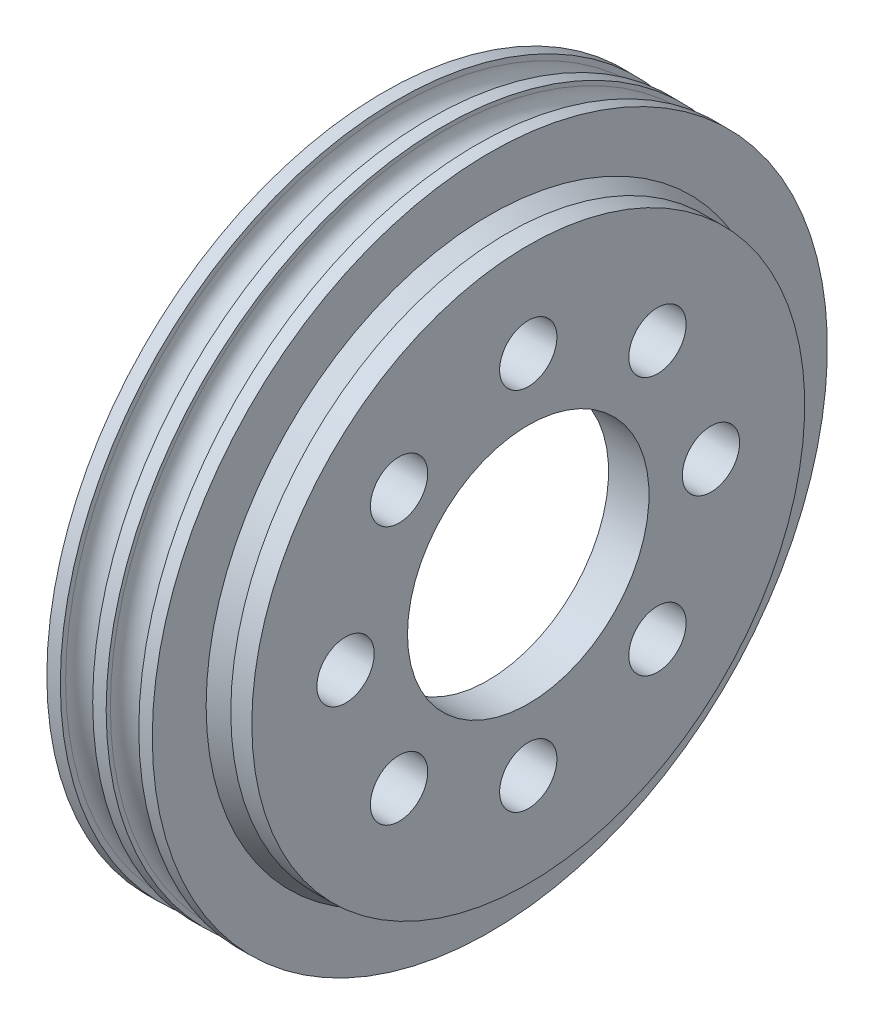
ISO-10303-21;
HEADER;
FILE_DESCRIPTION(('STEP AP214'),'2;1');
FILE_NAME('part.step','',(''),(''),'','','');
FILE_SCHEMA(('AUTOMOTIVE_DESIGN { 1 0 10303 214 1 1 1 1 }'));
ENDSEC;
DATA;
#1=APPLICATION_CONTEXT('core data for automotive mechanical design processes');
#2=APPLICATION_PROTOCOL_DEFINITION('international standard','automotive_design',2000,#1);
#3=PRODUCT_CONTEXT('',#1,'mechanical');
#4=PRODUCT('Part','Part','',(#3));
#5=PRODUCT_RELATED_PRODUCT_CATEGORY('part','',(#4));
#6=PRODUCT_DEFINITION_FORMATION('','',#4);
#7=PRODUCT_DEFINITION_CONTEXT('part definition',#1,'design');
#8=PRODUCT_DEFINITION('design','',#6,#7);
#9=PRODUCT_DEFINITION_SHAPE('','',#8);
#10=(LENGTH_UNIT() NAMED_UNIT(*) SI_UNIT(.MILLI.,.METRE.));
#11=(NAMED_UNIT(*) PLANE_ANGLE_UNIT() SI_UNIT($,.RADIAN.));
#12=(NAMED_UNIT(*) SI_UNIT($,.STERADIAN.) SOLID_ANGLE_UNIT());
#13=UNCERTAINTY_MEASURE_WITH_UNIT(LENGTH_MEASURE(1.E-05),#10,'distance_accuracy_value','');
#14=(GEOMETRIC_REPRESENTATION_CONTEXT(3) GLOBAL_UNCERTAINTY_ASSIGNED_CONTEXT((#13)) GLOBAL_UNIT_ASSIGNED_CONTEXT((#10,
#11,#12)) REPRESENTATION_CONTEXT('',''));
#15=CARTESIAN_POINT('',(0.,0.,0.));
#16=DIRECTION('',(0.,0.,1.));
#17=DIRECTION('',(1.,0.,0.));
#18=AXIS2_PLACEMENT_3D('',#15,#16,#17);
#19=CARTESIAN_POINT('',(-24.7571865671056,-45.2302228412257,0.));
#20=DIRECTION('',(-1.,0.,0.));
#21=DIRECTION('',(0.,0.,1.));
#22=AXIS2_PLACEMENT_3D('',#19,#20,#21);
#23=CYLINDRICAL_SURFACE('',#22,50.0619205916236);
#24=CARTESIAN_POINT('',(-0.743924059017714,-45.2302228412257,0.));
#25=DIRECTION('',(-1.,0.,0.));
#26=DIRECTION('',(0.,0.,1.));
#27=AXIS2_PLACEMENT_3D('',#24,#25,#26);
#28=CIRCLE('',#27,50.0619205916236);
#29=CARTESIAN_POINT('',(-0.743924059017714,-45.2302228412257,50.0619205916236));
#30=VERTEX_POINT('',#29);
#31=EDGE_CURVE('E86',#30,#30,#28,.T.);
#32=ORIENTED_EDGE('',*,*,#31,.F.);
#33=EDGE_LOOP('',(#32));
#34=FACE_BOUND('',#33,.T.);
#35=CARTESIAN_POINT('',(1.25607594098229,-45.2302228412257,0.));
#36=DIRECTION('',(-1.,0.,0.));
#37=DIRECTION('',(0.,0.,1.));
#38=AXIS2_PLACEMENT_3D('',#35,#36,#37);
#39=CIRCLE('',#38,50.0619205916236);
#40=CARTESIAN_POINT('',(1.25607594098229,-45.2302228412257,50.0619205916236));
#41=VERTEX_POINT('',#40);
#42=EDGE_CURVE('E10',#41,#41,#39,.T.);
#43=ORIENTED_EDGE('',*,*,#42,.T.);
#44=EDGE_LOOP('',(#43));
#45=FACE_BOUND('',#44,.T.);
#46=ADVANCED_FACE('F31',(#34,#45),#23,.T.);
#47=CARTESIAN_POINT('',(1.25607594098229,4.83169775039795,0.));
#48=DIRECTION('',(-1.,0.,0.));
#49=DIRECTION('',(0.,0.,1.));
#50=AXIS2_PLACEMENT_3D('',#47,#48,#49);
#51=PLANE('',#50);
#52=ORIENTED_EDGE('',*,*,#42,.F.);
#53=EDGE_LOOP('',(#52));
#54=FACE_BOUND('',#53,.T.);
#55=CARTESIAN_POINT('',(1.25607594098229,-45.2302228412257,0.));
#56=DIRECTION('',(-1.,0.,0.));
#57=DIRECTION('',(0.,0.,1.));
#58=AXIS2_PLACEMENT_3D('',#55,#56,#57);
#59=CIRCLE('',#58,42.0736581945583);
#60=CARTESIAN_POINT('',(1.25607594098229,-45.2302228412257,42.0736581945583));
#61=VERTEX_POINT('',#60);
#62=EDGE_CURVE('E37',#61,#61,#59,.T.);
#63=ORIENTED_EDGE('',*,*,#62,.T.);
#64=EDGE_LOOP('',(#63));
#65=FACE_BOUND('',#64,.T.);
#66=ADVANCED_FACE('F226',(#54,#65),#51,.F.);
#67=CARTESIAN_POINT('',(3.83593518708346,-45.2302228412257,0.));
#68=DIRECTION('',(-1.,0.,0.));
#69=DIRECTION('',(0.,0.,1.));
#70=AXIS2_PLACEMENT_3D('',#67,#68,#69);
#71=CONICAL_SURFACE('',#70,41.,0.394367245897445);
#72=ORIENTED_EDGE('',*,*,#62,.F.);
#73=EDGE_LOOP('',(#72));
#74=FACE_BOUND('',#73,.T.);
#75=CARTESIAN_POINT('',(3.83593518708346,-45.2302228412257,0.));
#76=DIRECTION('',(-1.,0.,0.));
#77=DIRECTION('',(0.,0.,1.));
#78=AXIS2_PLACEMENT_3D('',#75,#76,#77);
#79=CIRCLE('',#78,41.);
#80=CARTESIAN_POINT('',(3.83593518708346,-45.2302228412257,41.));
#81=VERTEX_POINT('',#80);
#82=EDGE_CURVE('E41',#81,#81,#79,.T.);
#83=ORIENTED_EDGE('',*,*,#82,.T.);
#84=EDGE_LOOP('',(#83));
#85=FACE_BOUND('',#84,.T.);
#86=ADVANCED_FACE('F230',(#74,#85),#71,.T.);
#87=CARTESIAN_POINT('',(-24.7571865671056,-45.2302228412257,0.));
#88=DIRECTION('',(-1.,0.,0.));
#89=DIRECTION('',(0.,0.,1.));
#90=AXIS2_PLACEMENT_3D('',#87,#88,#89);
#91=CYLINDRICAL_SURFACE('',#90,41.);
#92=ORIENTED_EDGE('',*,*,#82,.F.);
#93=EDGE_LOOP('',(#92));
#94=FACE_BOUND('',#93,.T.);
#95=CARTESIAN_POINT('',(6.95607594098228,-45.2302228412257,0.));
#96=DIRECTION('',(-1.,0.,0.));
#97=DIRECTION('',(0.,0.,1.));
#98=AXIS2_PLACEMENT_3D('',#95,#96,#97);
#99=CIRCLE('',#98,41.);
#100=CARTESIAN_POINT('',(6.95607594098228,-45.2302228412257,41.));
#101=VERTEX_POINT('',#100);
#102=EDGE_CURVE('E45',#101,#101,#99,.T.);
#103=ORIENTED_EDGE('',*,*,#102,.T.);
#104=EDGE_LOOP('',(#103));
#105=FACE_BOUND('',#104,.T.);
#106=ADVANCED_FACE('F235',(#94,#105),#91,.T.);
#107=CARTESIAN_POINT('',(6.95607594098229,-27.318302249602,0.));
#108=DIRECTION('',(-1.,0.,0.));
#109=DIRECTION('',(0.,0.,1.));
#110=AXIS2_PLACEMENT_3D('',#107,#108,#109);
#111=PLANE('',#110);
#112=CARTESIAN_POINT('',(6.95607594098229,-26.0676290710704,-19.162593770156));
#113=DIRECTION('',(-1.,0.,0.));
#114=DIRECTION('',(0.,0.,1.));
#115=AXIS2_PLACEMENT_3D('',#112,#113,#114);
#116=CIRCLE('',#115,4.25000000000054);
#117=CARTESIAN_POINT('',(6.95607594098229,-26.0676290710704,-14.9125937701555));
#118=VERTEX_POINT('',#117);
#119=EDGE_CURVE('E131',#118,#118,#116,.T.);
#120=ORIENTED_EDGE('',*,*,#119,.T.);
#121=EDGE_LOOP('',(#120));
#122=FACE_BOUND('',#121,.T.);
#123=CARTESIAN_POINT('',(6.95607594098229,-45.2302228412257,-27.0999999999996));
#124=DIRECTION('',(-1.,0.,0.));
#125=DIRECTION('',(0.,0.,1.));
#126=AXIS2_PLACEMENT_3D('',#123,#124,#125);
#127=CIRCLE('',#126,4.25);
#128=CARTESIAN_POINT('',(6.95607594098229,-45.2302228412257,-22.8499999999996));
#129=VERTEX_POINT('',#128);
#130=EDGE_CURVE('E125',#129,#129,#127,.T.);
#131=ORIENTED_EDGE('',*,*,#130,.T.);
#132=EDGE_LOOP('',(#131));
#133=FACE_BOUND('',#132,.T.);
#134=CARTESIAN_POINT('',(6.95607594098229,-64.3928166113812,-19.162593770155));
#135=DIRECTION('',(-1.,0.,0.));
#136=DIRECTION('',(0.,0.,1.));
#137=AXIS2_PLACEMENT_3D('',#134,#135,#136);
#138=CIRCLE('',#137,4.25);
#139=CARTESIAN_POINT('',(6.95607594098229,-64.3928166113812,-14.912593770155));
#140=VERTEX_POINT('',#139);
#141=EDGE_CURVE('E119',#140,#140,#138,.T.);
#142=ORIENTED_EDGE('',*,*,#141,.T.);
#143=EDGE_LOOP('',(#142));
#144=FACE_BOUND('',#143,.T.);
#145=CARTESIAN_POINT('',(6.95607594098229,-72.3302228412257,5.71033877735244E-13));
#146=DIRECTION('',(-1.,0.,0.));
#147=DIRECTION('',(0.,0.,1.));
#148=AXIS2_PLACEMENT_3D('',#145,#146,#147);
#149=CIRCLE('',#148,4.25);
#150=CARTESIAN_POINT('',(6.95607594098229,-72.3302228412257,4.25000000000057));
#151=VERTEX_POINT('',#150);
#152=EDGE_CURVE('E113',#151,#151,#149,.T.);
#153=ORIENTED_EDGE('',*,*,#152,.T.);
#154=EDGE_LOOP('',(#153));
#155=FACE_BOUND('',#154,.T.);
#156=CARTESIAN_POINT('',(6.95607594098229,-64.3928166113809,19.162593770156));
#157=DIRECTION('',(-1.,0.,0.));
#158=DIRECTION('',(0.,0.,1.));
#159=AXIS2_PLACEMENT_3D('',#156,#157,#158);
#160=CIRCLE('',#159,4.25);
#161=CARTESIAN_POINT('',(6.95607594098229,-64.3928166113809,23.412593770156));
#162=VERTEX_POINT('',#161);
#163=EDGE_CURVE('E107',#162,#162,#160,.T.);
#164=ORIENTED_EDGE('',*,*,#163,.T.);
#165=EDGE_LOOP('',(#164));
#166=FACE_BOUND('',#165,.T.);
#167=CARTESIAN_POINT('',(6.95607594098229,-45.2302228412254,27.1000000000004));
#168=DIRECTION('',(-1.,0.,0.));
#169=DIRECTION('',(0.,0.,1.));
#170=AXIS2_PLACEMENT_3D('',#167,#168,#169);
#171=CIRCLE('',#170,4.25);
#172=CARTESIAN_POINT('',(6.95607594098229,-45.2302228412254,31.3500000000004));
#173=VERTEX_POINT('',#172);
#174=EDGE_CURVE('E101',#173,#173,#171,.T.);
#175=ORIENTED_EDGE('',*,*,#174,.T.);
#176=EDGE_LOOP('',(#175));
#177=FACE_BOUND('',#176,.T.);
#178=CARTESIAN_POINT('',(6.95607594098229,-26.06762907107,19.1625937701556));
#179=DIRECTION('',(-1.,0.,0.));
#180=DIRECTION('',(0.,0.,1.));
#181=AXIS2_PLACEMENT_3D('',#178,#179,#180);
#182=CIRCLE('',#181,4.25);
#183=CARTESIAN_POINT('',(6.95607594098229,-26.06762907107,23.4125937701556));
#184=VERTEX_POINT('',#183);
#185=EDGE_CURVE('E95',#184,#184,#182,.T.);
#186=ORIENTED_EDGE('',*,*,#185,.T.);
#187=EDGE_LOOP('',(#186));
#188=FACE_BOUND('',#187,.T.);
#189=CARTESIAN_POINT('',(6.95607594098229,-18.1302228412257,0.));
#190=DIRECTION('',(-1.,0.,0.));
#191=DIRECTION('',(0.,0.,1.));
#192=AXIS2_PLACEMENT_3D('',#189,#190,#191);
#193=CIRCLE('',#192,4.25);
#194=CARTESIAN_POINT('',(6.95607594098229,-18.1302228412257,4.25));
#195=VERTEX_POINT('',#194);
#196=EDGE_CURVE('E89',#195,#195,#193,.T.);
#197=ORIENTED_EDGE('',*,*,#196,.T.);
#198=EDGE_LOOP('',(#197));
#199=FACE_BOUND('',#198,.T.);
#200=ORIENTED_EDGE('',*,*,#102,.F.);
#201=EDGE_LOOP('',(#200));
#202=FACE_BOUND('',#201,.T.);
#203=CARTESIAN_POINT('',(6.95607594098228,-45.2302228412257,0.));
#204=DIRECTION('',(-1.,0.,0.));
#205=DIRECTION('',(0.,0.,1.));
#206=AXIS2_PLACEMENT_3D('',#203,#204,#205);
#207=CIRCLE('',#206,17.9119205916236);
#208=CARTESIAN_POINT('',(6.95607594098228,-45.2302228412257,17.9119205916236));
#209=VERTEX_POINT('',#208);
#210=EDGE_CURVE('E50',#209,#209,#207,.T.);
#211=ORIENTED_EDGE('',*,*,#210,.T.);
#212=EDGE_LOOP('',(#211));
#213=FACE_BOUND('',#212,.T.);
#214=ADVANCED_FACE('F241',(#122,#133,#144,#155,#166,#177,#188,#199,#202,#213),#111,.F.);
#215=CARTESIAN_POINT('',(-24.7571865671056,-45.2302228412257,0.));
#216=DIRECTION('',(-1.,0.,0.));
#217=DIRECTION('',(0.,0.,1.));
#218=AXIS2_PLACEMENT_3D('',#215,#216,#217);
#219=CYLINDRICAL_SURFACE('',#218,17.9119205916236);
#220=ORIENTED_EDGE('',*,*,#210,.F.);
#221=EDGE_LOOP('',(#220));
#222=FACE_BOUND('',#221,.T.);
#223=CARTESIAN_POINT('',(0.956075940982286,-45.2302228412257,0.));
#224=DIRECTION('',(-1.,0.,0.));
#225=DIRECTION('',(0.,0.,1.));
#226=AXIS2_PLACEMENT_3D('',#223,#224,#225);
#227=CIRCLE('',#226,17.9119205916236);
#228=CARTESIAN_POINT('',(0.956075940982286,-45.2302228412257,17.9119205916236));
#229=VERTEX_POINT('',#228);
#230=EDGE_CURVE('E53',#229,#229,#227,.T.);
#231=ORIENTED_EDGE('',*,*,#230,.T.);
#232=EDGE_LOOP('',(#231));
#233=FACE_BOUND('',#232,.T.);
#234=ADVANCED_FACE('F145',(#222,#233),#219,.F.);
#235=CARTESIAN_POINT('',(0.956075940982286,-27.318302249602,0.));
#236=DIRECTION('',(1.,0.,0.));
#237=DIRECTION('',(0.,0.,-1.));
#238=AXIS2_PLACEMENT_3D('',#235,#236,#237);
#239=PLANE('',#238);
#240=CARTESIAN_POINT('',(0.956075940982286,-26.0676290710704,-19.162593770156));
#241=DIRECTION('',(-1.,0.,0.));
#242=DIRECTION('',(0.,0.,1.));
#243=AXIS2_PLACEMENT_3D('',#240,#241,#242);
#244=CIRCLE('',#243,4.25000000000054);
#245=CARTESIAN_POINT('',(0.956075940982286,-26.0676290710704,-14.9125937701555));
#246=VERTEX_POINT('',#245);
#247=EDGE_CURVE('E134',#246,#246,#244,.T.);
#248=ORIENTED_EDGE('',*,*,#247,.F.);
#249=EDGE_LOOP('',(#248));
#250=FACE_BOUND('',#249,.T.);
#251=CARTESIAN_POINT('',(0.956075940982286,-45.2302228412257,-27.0999999999996));
#252=DIRECTION('',(-1.,0.,0.));
#253=DIRECTION('',(0.,0.,1.));
#254=AXIS2_PLACEMENT_3D('',#251,#252,#253);
#255=CIRCLE('',#254,4.25);
#256=CARTESIAN_POINT('',(0.956075940982286,-45.2302228412257,-22.8499999999996));
#257=VERTEX_POINT('',#256);
#258=EDGE_CURVE('E128',#257,#257,#255,.T.);
#259=ORIENTED_EDGE('',*,*,#258,.F.);
#260=EDGE_LOOP('',(#259));
#261=FACE_BOUND('',#260,.T.);
#262=CARTESIAN_POINT('',(0.956075940982286,-64.3928166113812,-19.162593770155));
#263=DIRECTION('',(-1.,0.,0.));
#264=DIRECTION('',(0.,0.,1.));
#265=AXIS2_PLACEMENT_3D('',#262,#263,#264);
#266=CIRCLE('',#265,4.25);
#267=CARTESIAN_POINT('',(0.956075940982286,-64.3928166113812,-14.912593770155));
#268=VERTEX_POINT('',#267);
#269=EDGE_CURVE('E122',#268,#268,#266,.T.);
#270=ORIENTED_EDGE('',*,*,#269,.F.);
#271=EDGE_LOOP('',(#270));
#272=FACE_BOUND('',#271,.T.);
#273=CARTESIAN_POINT('',(0.956075940982286,-72.3302228412257,5.71033877735244E-13));
#274=DIRECTION('',(-1.,0.,0.));
#275=DIRECTION('',(0.,0.,1.));
#276=AXIS2_PLACEMENT_3D('',#273,#274,#275);
#277=CIRCLE('',#276,4.25);
#278=CARTESIAN_POINT('',(0.956075940982286,-72.3302228412257,4.25000000000057));
#279=VERTEX_POINT('',#278);
#280=EDGE_CURVE('E116',#279,#279,#277,.T.);
#281=ORIENTED_EDGE('',*,*,#280,.F.);
#282=EDGE_LOOP('',(#281));
#283=FACE_BOUND('',#282,.T.);
#284=CARTESIAN_POINT('',(0.956075940982286,-64.3928166113809,19.162593770156));
#285=DIRECTION('',(-1.,0.,0.));
#286=DIRECTION('',(0.,0.,1.));
#287=AXIS2_PLACEMENT_3D('',#284,#285,#286);
#288=CIRCLE('',#287,4.25);
#289=CARTESIAN_POINT('',(0.956075940982286,-64.3928166113809,23.412593770156));
#290=VERTEX_POINT('',#289);
#291=EDGE_CURVE('E110',#290,#290,#288,.T.);
#292=ORIENTED_EDGE('',*,*,#291,.F.);
#293=EDGE_LOOP('',(#292));
#294=FACE_BOUND('',#293,.T.);
#295=CARTESIAN_POINT('',(0.956075940982286,-45.2302228412254,27.1000000000004));
#296=DIRECTION('',(-1.,0.,0.));
#297=DIRECTION('',(0.,0.,1.));
#298=AXIS2_PLACEMENT_3D('',#295,#296,#297);
#299=CIRCLE('',#298,4.25);
#300=CARTESIAN_POINT('',(0.956075940982286,-45.2302228412254,31.3500000000004));
#301=VERTEX_POINT('',#300);
#302=EDGE_CURVE('E104',#301,#301,#299,.T.);
#303=ORIENTED_EDGE('',*,*,#302,.F.);
#304=EDGE_LOOP('',(#303));
#305=FACE_BOUND('',#304,.T.);
#306=CARTESIAN_POINT('',(0.956075940982286,-26.06762907107,19.1625937701556));
#307=DIRECTION('',(-1.,0.,0.));
#308=DIRECTION('',(0.,0.,1.));
#309=AXIS2_PLACEMENT_3D('',#306,#307,#308);
#310=CIRCLE('',#309,4.25);
#311=CARTESIAN_POINT('',(0.956075940982286,-26.06762907107,23.4125937701556));
#312=VERTEX_POINT('',#311);
#313=EDGE_CURVE('E98',#312,#312,#310,.T.);
#314=ORIENTED_EDGE('',*,*,#313,.F.);
#315=EDGE_LOOP('',(#314));
#316=FACE_BOUND('',#315,.T.);
#317=CARTESIAN_POINT('',(0.956075940982286,-18.1302228412257,0.));
#318=DIRECTION('',(-1.,0.,0.));
#319=DIRECTION('',(0.,0.,1.));
#320=AXIS2_PLACEMENT_3D('',#317,#318,#319);
#321=CIRCLE('',#320,4.25);
#322=CARTESIAN_POINT('',(0.956075940982286,-18.1302228412257,4.25));
#323=VERTEX_POINT('',#322);
#324=EDGE_CURVE('E92',#323,#323,#321,.T.);
#325=ORIENTED_EDGE('',*,*,#324,.F.);
#326=EDGE_LOOP('',(#325));
#327=FACE_BOUND('',#326,.T.);
#328=ORIENTED_EDGE('',*,*,#230,.F.);
#329=EDGE_LOOP('',(#328));
#330=FACE_BOUND('',#329,.T.);
#331=CARTESIAN_POINT('',(0.956075940982286,-45.2302228412257,0.));
#332=DIRECTION('',(-1.,0.,0.));
#333=DIRECTION('',(0.,0.,1.));
#334=AXIS2_PLACEMENT_3D('',#331,#332,#333);
#335=CIRCLE('',#334,36.);
#336=CARTESIAN_POINT('',(0.956075940982286,-45.2302228412257,36.));
#337=VERTEX_POINT('',#336);
#338=EDGE_CURVE('E56',#337,#337,#335,.T.);
#339=ORIENTED_EDGE('',*,*,#338,.T.);
#340=EDGE_LOOP('',(#339));
#341=FACE_BOUND('',#340,.T.);
#342=ADVANCED_FACE('F141',(#250,#261,#272,#283,#294,#305,#316,#327,#330,#341),#239,.F.);
#343=CARTESIAN_POINT('',(-14.4439240590177,-45.2302228412257,0.));
#344=DIRECTION('',(-1.,0.,0.));
#345=DIRECTION('',(0.,0.,1.));
#346=AXIS2_PLACEMENT_3D('',#343,#344,#345);
#347=CONICAL_SURFACE('',#346,43.9017869483155,0.474075015623964);
#348=ORIENTED_EDGE('',*,*,#338,.F.);
#349=EDGE_LOOP('',(#348));
#350=FACE_BOUND('',#349,.T.);
#351=CARTESIAN_POINT('',(-14.4439240590177,-45.2302228412257,0.));
#352=DIRECTION('',(-1.,0.,0.));
#353=DIRECTION('',(0.,0.,1.));
#354=AXIS2_PLACEMENT_3D('',#351,#352,#353);
#355=CIRCLE('',#354,43.9017869483155);
#356=CARTESIAN_POINT('',(-14.4439240590177,-45.2302228412257,43.9017869483155));
#357=VERTEX_POINT('',#356);
#358=EDGE_CURVE('E59',#357,#357,#355,.T.);
#359=ORIENTED_EDGE('',*,*,#358,.T.);
#360=EDGE_LOOP('',(#359));
#361=FACE_BOUND('',#360,.T.);
#362=ADVANCED_FACE('F144',(#350,#361),#347,.F.);
#363=CARTESIAN_POINT('',(-14.4439240590177,4.76977715877434,0.));
#364=DIRECTION('',(1.,0.,0.));
#365=DIRECTION('',(0.,0.,-1.));
#366=AXIS2_PLACEMENT_3D('',#363,#364,#365);
#367=PLANE('',#366);
#368=ORIENTED_EDGE('',*,*,#358,.F.);
#369=EDGE_LOOP('',(#368));
#370=FACE_BOUND('',#369,.T.);
#371=CARTESIAN_POINT('',(-14.4439240590177,-45.2302228412257,0.));
#372=DIRECTION('',(-1.,0.,0.));
#373=DIRECTION('',(0.,0.,1.));
#374=AXIS2_PLACEMENT_3D('',#371,#372,#373);
#375=CIRCLE('',#374,50.);
#376=CARTESIAN_POINT('',(-14.4439240590177,-45.2302228412257,50.));
#377=VERTEX_POINT('',#376);
#378=EDGE_CURVE('E62',#377,#377,#375,.T.);
#379=ORIENTED_EDGE('',*,*,#378,.T.);
#380=EDGE_LOOP('',(#379));
#381=FACE_BOUND('',#380,.T.);
#382=ADVANCED_FACE('F167',(#370,#381),#367,.F.);
#383=CARTESIAN_POINT('',(-24.7571865671056,-45.2302228412257,0.));
#384=DIRECTION('',(-1.,0.,0.));
#385=DIRECTION('',(0.,0.,1.));
#386=AXIS2_PLACEMENT_3D('',#383,#384,#385);
#387=CYLINDRICAL_SURFACE('',#386,50.);
#388=ORIENTED_EDGE('',*,*,#378,.F.);
#389=EDGE_LOOP('',(#388));
#390=FACE_BOUND('',#389,.T.);
#391=CARTESIAN_POINT('',(-12.4439240590177,-45.2302228412257,0.));
#392=DIRECTION('',(-1.,0.,0.));
#393=DIRECTION('',(0.,0.,1.));
#394=AXIS2_PLACEMENT_3D('',#391,#392,#393);
#395=CIRCLE('',#394,50.);
#396=CARTESIAN_POINT('',(-12.4439240590177,-45.2302228412257,50.));
#397=VERTEX_POINT('',#396);
#398=EDGE_CURVE('E65',#397,#397,#395,.T.);
#399=ORIENTED_EDGE('',*,*,#398,.T.);
#400=EDGE_LOOP('',(#399));
#401=FACE_BOUND('',#400,.T.);
#402=ADVANCED_FACE('F173',(#390,#401),#387,.T.);
#403=CARTESIAN_POINT('',(-12.4439240590177,4.76977715877434,0.));
#404=DIRECTION('',(-1.,0.,0.));
#405=DIRECTION('',(0.,0.,1.));
#406=AXIS2_PLACEMENT_3D('',#403,#404,#405);
#407=PLANE('',#406);
#408=ORIENTED_EDGE('',*,*,#398,.F.);
#409=EDGE_LOOP('',(#408));
#410=FACE_BOUND('',#409,.T.);
#411=CARTESIAN_POINT('',(-12.4439240590177,-45.2302228412257,0.));
#412=DIRECTION('',(-1.,0.,0.));
#413=DIRECTION('',(0.,0.,1.));
#414=AXIS2_PLACEMENT_3D('',#411,#412,#413);
#415=CIRCLE('',#414,49.2139760602775);
#416=CARTESIAN_POINT('',(-12.4439240590177,-45.2302228412257,49.2139760602775));
#417=VERTEX_POINT('',#416);
#418=EDGE_CURVE('E68',#417,#417,#415,.T.);
#419=ORIENTED_EDGE('',*,*,#418,.T.);
#420=EDGE_LOOP('',(#419));
#421=FACE_BOUND('',#420,.T.);
#422=ADVANCED_FACE('F179',(#410,#421),#407,.F.);
#423=CARTESIAN_POINT('',(-10.0439240590177,-45.2302228412257,0.));
#424=DIRECTION('',(-1.,0.,0.));
#425=DIRECTION('',(0.,0.,1.));
#426=AXIS2_PLACEMENT_3D('',#423,#424,#425);
#427=TOROIDAL_SURFACE('',#426,49.2139760602775,2.4);
#428=ORIENTED_EDGE('',*,*,#418,.F.);
#429=EDGE_LOOP('',(#428));
#430=FACE_BOUND('',#429,.T.);
#431=CARTESIAN_POINT('',(-7.64392405901772,-45.2302228412257,0.));
#432=DIRECTION('',(-1.,0.,0.));
#433=DIRECTION('',(0.,0.,1.));
#434=AXIS2_PLACEMENT_3D('',#431,#432,#433);
#435=CIRCLE('',#434,49.2139760602775);
#436=CARTESIAN_POINT('',(-7.64392405901772,-45.2302228412257,49.2139760602775));
#437=VERTEX_POINT('',#436);
#438=EDGE_CURVE('E71',#437,#437,#435,.T.);
#439=ORIENTED_EDGE('',*,*,#438,.T.);
#440=EDGE_LOOP('',(#439));
#441=FACE_BOUND('',#440,.T.);
#442=ADVANCED_FACE('F185',(#430,#441),#427,.F.);
#443=CARTESIAN_POINT('',(-7.64392405901772,3.98375321905186,0.));
#444=DIRECTION('',(1.,0.,0.));
#445=DIRECTION('',(0.,0.,-1.));
#446=AXIS2_PLACEMENT_3D('',#443,#444,#445);
#447=PLANE('',#446);
#448=ORIENTED_EDGE('',*,*,#438,.F.);
#449=EDGE_LOOP('',(#448));
#450=FACE_BOUND('',#449,.T.);
#451=CARTESIAN_POINT('',(-7.64392405901772,-45.2302228412257,0.));
#452=DIRECTION('',(-1.,0.,0.));
#453=DIRECTION('',(0.,0.,1.));
#454=AXIS2_PLACEMENT_3D('',#451,#452,#453);
#455=CIRCLE('',#454,50.);
#456=CARTESIAN_POINT('',(-7.64392405901772,-45.2302228412257,50.));
#457=VERTEX_POINT('',#456);
#458=EDGE_CURVE('E74',#457,#457,#455,.T.);
#459=ORIENTED_EDGE('',*,*,#458,.T.);
#460=EDGE_LOOP('',(#459));
#461=FACE_BOUND('',#460,.T.);
#462=ADVANCED_FACE('F191',(#450,#461),#447,.F.);
#463=CARTESIAN_POINT('',(-24.7571865671056,-45.2302228412257,0.));
#464=DIRECTION('',(-1.,0.,0.));
#465=DIRECTION('',(0.,0.,1.));
#466=AXIS2_PLACEMENT_3D('',#463,#464,#465);
#467=CYLINDRICAL_SURFACE('',#466,50.);
#468=ORIENTED_EDGE('',*,*,#458,.F.);
#469=EDGE_LOOP('',(#468));
#470=FACE_BOUND('',#469,.T.);
#471=CARTESIAN_POINT('',(-5.64392405901772,-45.2302228412257,0.));
#472=DIRECTION('',(-1.,0.,0.));
#473=DIRECTION('',(0.,0.,1.));
#474=AXIS2_PLACEMENT_3D('',#471,#472,#473);
#475=CIRCLE('',#474,50.);
#476=CARTESIAN_POINT('',(-5.64392405901772,-45.2302228412257,50.));
#477=VERTEX_POINT('',#476);
#478=EDGE_CURVE('E77',#477,#477,#475,.T.);
#479=ORIENTED_EDGE('',*,*,#478,.T.);
#480=EDGE_LOOP('',(#479));
#481=FACE_BOUND('',#480,.T.);
#482=ADVANCED_FACE('F197',(#470,#481),#467,.T.);
#483=CARTESIAN_POINT('',(-5.64392405901772,4.15038965049702,0.));
#484=DIRECTION('',(-1.,0.,0.));
#485=DIRECTION('',(0.,0.,1.));
#486=AXIS2_PLACEMENT_3D('',#483,#484,#485);
#487=PLANE('',#486);
#488=ORIENTED_EDGE('',*,*,#478,.F.);
#489=EDGE_LOOP('',(#488));
#490=FACE_BOUND('',#489,.T.);
#491=CARTESIAN_POINT('',(-5.64392405901772,-45.2302228412257,0.));
#492=DIRECTION('',(-1.,0.,0.));
#493=DIRECTION('',(0.,0.,1.));
#494=AXIS2_PLACEMENT_3D('',#491,#492,#493);
#495=CIRCLE('',#494,49.3806124917227);
#496=CARTESIAN_POINT('',(-5.64392405901772,-45.2302228412257,49.3806124917227));
#497=VERTEX_POINT('',#496);
#498=EDGE_CURVE('E80',#497,#497,#495,.T.);
#499=ORIENTED_EDGE('',*,*,#498,.T.);
#500=EDGE_LOOP('',(#499));
#501=FACE_BOUND('',#500,.T.);
#502=ADVANCED_FACE('F203',(#490,#501),#487,.F.);
#503=CARTESIAN_POINT('',(-3.19392405901771,-45.2302228412257,0.));
#504=DIRECTION('',(-1.,0.,0.));
#505=DIRECTION('',(0.,0.,1.));
#506=AXIS2_PLACEMENT_3D('',#503,#504,#505);
#507=TOROIDAL_SURFACE('',#506,49.3806124917227,2.45);
#508=ORIENTED_EDGE('',*,*,#498,.F.);
#509=EDGE_LOOP('',(#508));
#510=FACE_BOUND('',#509,.T.);
#511=CARTESIAN_POINT('',(-0.743924059017714,-45.2302228412257,0.));
#512=DIRECTION('',(-1.,0.,0.));
#513=DIRECTION('',(0.,0.,1.));
#514=AXIS2_PLACEMENT_3D('',#511,#512,#513);
#515=CIRCLE('',#514,49.3806124917227);
#516=CARTESIAN_POINT('',(-0.743924059017714,-45.2302228412257,49.3806124917227));
#517=VERTEX_POINT('',#516);
#518=EDGE_CURVE('E83',#517,#517,#515,.T.);
#519=ORIENTED_EDGE('',*,*,#518,.T.);
#520=EDGE_LOOP('',(#519));
#521=FACE_BOUND('',#520,.T.);
#522=ADVANCED_FACE('F209',(#510,#521),#507,.F.);
#523=CARTESIAN_POINT('',(-0.743924059017714,4.83169775039795,0.));
#524=DIRECTION('',(1.,0.,0.));
#525=DIRECTION('',(0.,0.,-1.));
#526=AXIS2_PLACEMENT_3D('',#523,#524,#525);
#527=PLANE('',#526);
#528=ORIENTED_EDGE('',*,*,#518,.F.);
#529=EDGE_LOOP('',(#528));
#530=FACE_BOUND('',#529,.T.);
#531=ORIENTED_EDGE('',*,*,#31,.T.);
#532=EDGE_LOOP('',(#531));
#533=FACE_BOUND('',#532,.T.);
#534=ADVANCED_FACE('F215',(#530,#533),#527,.F.);
#535=CARTESIAN_POINT('',(10.9560759409823,-18.1302228412257,0.));
#536=DIRECTION('',(-1.,0.,0.));
#537=DIRECTION('',(0.,0.,1.));
#538=AXIS2_PLACEMENT_3D('',#535,#536,#537);
#539=CYLINDRICAL_SURFACE('',#538,4.25);
#540=ORIENTED_EDGE('',*,*,#324,.T.);
#541=EDGE_LOOP('',(#540));
#542=FACE_BOUND('',#541,.T.);
#543=ORIENTED_EDGE('',*,*,#196,.F.);
#544=EDGE_LOOP('',(#543));
#545=FACE_BOUND('',#544,.T.);
#546=ADVANCED_FACE('F221',(#542,#545),#539,.F.);
#547=CARTESIAN_POINT('',(10.9560759409823,-26.06762907107,19.1625937701556));
#548=DIRECTION('',(-1.,0.,0.));
#549=DIRECTION('',(0.,0.,1.));
#550=AXIS2_PLACEMENT_3D('',#547,#548,#549);
#551=CYLINDRICAL_SURFACE('',#550,4.25);
#552=ORIENTED_EDGE('',*,*,#313,.T.);
#553=EDGE_LOOP('',(#552));
#554=FACE_BOUND('',#553,.T.);
#555=ORIENTED_EDGE('',*,*,#185,.F.);
#556=EDGE_LOOP('',(#555));
#557=FACE_BOUND('',#556,.T.);
#558=ADVANCED_FACE('F251',(#554,#557),#551,.F.);
#559=CARTESIAN_POINT('',(10.9560759409823,-45.2302228412254,27.1000000000004));
#560=DIRECTION('',(-1.,0.,0.));
#561=DIRECTION('',(0.,0.,1.));
#562=AXIS2_PLACEMENT_3D('',#559,#560,#561);
#563=CYLINDRICAL_SURFACE('',#562,4.25);
#564=ORIENTED_EDGE('',*,*,#302,.T.);
#565=EDGE_LOOP('',(#564));
#566=FACE_BOUND('',#565,.T.);
#567=ORIENTED_EDGE('',*,*,#174,.F.);
#568=EDGE_LOOP('',(#567));
#569=FACE_BOUND('',#568,.T.);
#570=ADVANCED_FACE('F255',(#566,#569),#563,.F.);
#571=CARTESIAN_POINT('',(10.9560759409823,-64.3928166113809,19.162593770156));
#572=DIRECTION('',(-1.,0.,0.));
#573=DIRECTION('',(0.,0.,1.));
#574=AXIS2_PLACEMENT_3D('',#571,#572,#573);
#575=CYLINDRICAL_SURFACE('',#574,4.25);
#576=ORIENTED_EDGE('',*,*,#291,.T.);
#577=EDGE_LOOP('',(#576));
#578=FACE_BOUND('',#577,.T.);
#579=ORIENTED_EDGE('',*,*,#163,.F.);
#580=EDGE_LOOP('',(#579));
#581=FACE_BOUND('',#580,.T.);
#582=ADVANCED_FACE('F259',(#578,#581),#575,.F.);
#583=CARTESIAN_POINT('',(10.9560759409823,-72.3302228412257,5.71033877735244E-13));
#584=DIRECTION('',(-1.,0.,0.));
#585=DIRECTION('',(0.,0.,1.));
#586=AXIS2_PLACEMENT_3D('',#583,#584,#585);
#587=CYLINDRICAL_SURFACE('',#586,4.25);
#588=ORIENTED_EDGE('',*,*,#280,.T.);
#589=EDGE_LOOP('',(#588));
#590=FACE_BOUND('',#589,.T.);
#591=ORIENTED_EDGE('',*,*,#152,.F.);
#592=EDGE_LOOP('',(#591));
#593=FACE_BOUND('',#592,.T.);
#594=ADVANCED_FACE('F263',(#590,#593),#587,.F.);
#595=CARTESIAN_POINT('',(10.9560759409823,-64.3928166113812,-19.162593770155));
#596=DIRECTION('',(-1.,0.,0.));
#597=DIRECTION('',(0.,0.,1.));
#598=AXIS2_PLACEMENT_3D('',#595,#596,#597);
#599=CYLINDRICAL_SURFACE('',#598,4.25);
#600=ORIENTED_EDGE('',*,*,#269,.T.);
#601=EDGE_LOOP('',(#600));
#602=FACE_BOUND('',#601,.T.);
#603=ORIENTED_EDGE('',*,*,#141,.F.);
#604=EDGE_LOOP('',(#603));
#605=FACE_BOUND('',#604,.T.);
#606=ADVANCED_FACE('F267',(#602,#605),#599,.F.);
#607=CARTESIAN_POINT('',(10.9560759409823,-45.2302228412257,-27.0999999999996));
#608=DIRECTION('',(-1.,0.,0.));
#609=DIRECTION('',(0.,0.,1.));
#610=AXIS2_PLACEMENT_3D('',#607,#608,#609);
#611=CYLINDRICAL_SURFACE('',#610,4.25);
#612=ORIENTED_EDGE('',*,*,#258,.T.);
#613=EDGE_LOOP('',(#612));
#614=FACE_BOUND('',#613,.T.);
#615=ORIENTED_EDGE('',*,*,#130,.F.);
#616=EDGE_LOOP('',(#615));
#617=FACE_BOUND('',#616,.T.);
#618=ADVANCED_FACE('F271',(#614,#617),#611,.F.);
#619=CARTESIAN_POINT('',(10.9560759409823,-26.0676290710704,-19.162593770156));
#620=DIRECTION('',(-1.,0.,0.));
#621=DIRECTION('',(0.,0.,1.));
#622=AXIS2_PLACEMENT_3D('',#619,#620,#621);
#623=CYLINDRICAL_SURFACE('',#622,4.25000000000054);
#624=ORIENTED_EDGE('',*,*,#247,.T.);
#625=EDGE_LOOP('',(#624));
#626=FACE_BOUND('',#625,.T.);
#627=ORIENTED_EDGE('',*,*,#119,.F.);
#628=EDGE_LOOP('',(#627));
#629=FACE_BOUND('',#628,.T.);
#630=ADVANCED_FACE('F138',(#626,#629),#623,.F.);
#631=CLOSED_SHELL('',(#46,#66,#86,#106,#214,#234,#342,#362,#382,#402,#422,#442,#462,#482,#502,
#522,#534,#546,#558,#570,#582,#594,#606,#618,#630));
#632=MANIFOLD_SOLID_BREP('B2',#631);
#633=ADVANCED_BREP_SHAPE_REPRESENTATION('',(#18,#632),#14);
#634=SHAPE_DEFINITION_REPRESENTATION(#9,#633);
ENDSEC;
END-ISO-10303-21;
